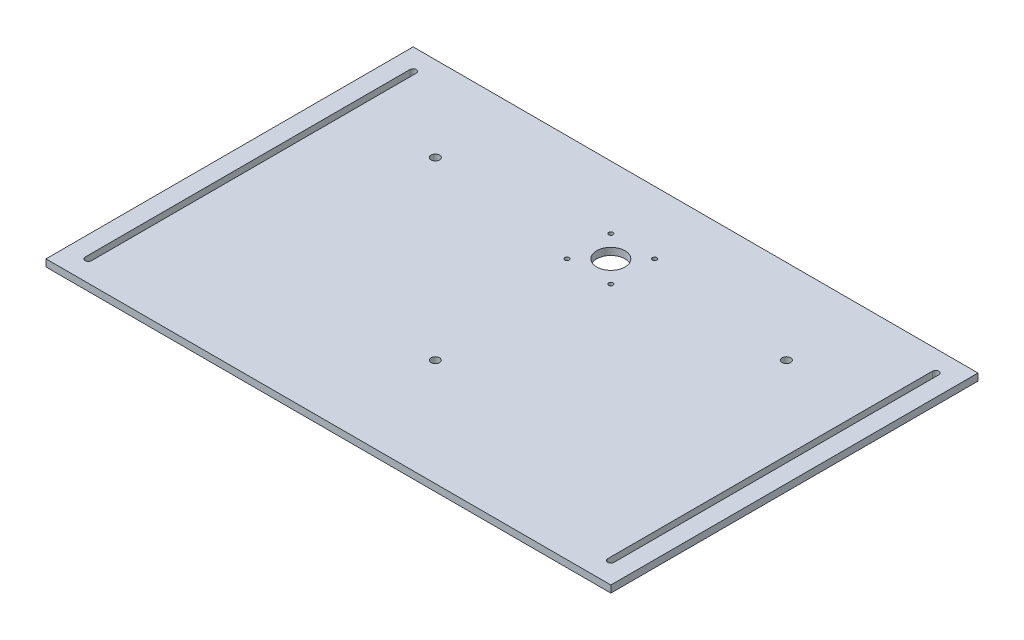
ISO-10303-21;
HEADER;
FILE_DESCRIPTION(('STEP AP214'),'2;1');
FILE_NAME('part.step','',(''),(''),'','','');
FILE_SCHEMA(('AUTOMOTIVE_DESIGN { 1 0 10303 214 1 1 1 1 }'));
ENDSEC;
DATA;
#1=APPLICATION_CONTEXT('core data for automotive mechanical design processes');
#2=APPLICATION_PROTOCOL_DEFINITION('international standard','automotive_design',2000,#1);
#3=PRODUCT_CONTEXT('',#1,'mechanical');
#4=PRODUCT('Part','Part','',(#3));
#5=PRODUCT_RELATED_PRODUCT_CATEGORY('part','',(#4));
#6=PRODUCT_DEFINITION_FORMATION('','',#4);
#7=PRODUCT_DEFINITION_CONTEXT('part definition',#1,'design');
#8=PRODUCT_DEFINITION('design','',#6,#7);
#9=PRODUCT_DEFINITION_SHAPE('','',#8);
#10=(LENGTH_UNIT() NAMED_UNIT(*) SI_UNIT(.MILLI.,.METRE.));
#11=(NAMED_UNIT(*) PLANE_ANGLE_UNIT() SI_UNIT($,.RADIAN.));
#12=(NAMED_UNIT(*) SI_UNIT($,.STERADIAN.) SOLID_ANGLE_UNIT());
#13=UNCERTAINTY_MEASURE_WITH_UNIT(LENGTH_MEASURE(1.E-05),#10,'distance_accuracy_value','');
#14=(GEOMETRIC_REPRESENTATION_CONTEXT(3) GLOBAL_UNCERTAINTY_ASSIGNED_CONTEXT((#13)) GLOBAL_UNIT_ASSIGNED_CONTEXT((#10,
#11,#12)) REPRESENTATION_CONTEXT('',''));
#15=CARTESIAN_POINT('',(0.,0.,0.));
#16=DIRECTION('',(0.,0.,1.));
#17=DIRECTION('',(1.,0.,0.));
#18=AXIS2_PLACEMENT_3D('',#15,#16,#17);
#19=CARTESIAN_POINT('',(-200.,5.,0.));
#20=DIRECTION('',(1.,0.,0.));
#21=DIRECTION('',(0.,0.,-1.));
#22=AXIS2_PLACEMENT_3D('',#19,#20,#21);
#23=PLANE('',#22);
#24=DIRECTION('',(0.,0.,1.));
#25=VECTOR('',#24,1.);
#26=CARTESIAN_POINT('',(-200.,0.,0.));
#27=LINE('',#26,#25);
#28=CARTESIAN_POINT('',(-200.,0.,-130.));
#29=VERTEX_POINT('',#28);
#30=CARTESIAN_POINT('',(-200.,0.,130.));
#31=VERTEX_POINT('',#30);
#32=EDGE_CURVE('E168',#29,#31,#27,.T.);
#33=ORIENTED_EDGE('',*,*,#32,.T.);
#34=DIRECTION('',(0.,-1.,0.));
#35=VECTOR('',#34,1.);
#36=CARTESIAN_POINT('',(-200.,5.,130.));
#37=LINE('',#36,#35);
#38=CARTESIAN_POINT('',(-200.,5.,130.));
#39=VERTEX_POINT('',#38);
#40=EDGE_CURVE('E11',#39,#31,#37,.T.);
#41=ORIENTED_EDGE('',*,*,#40,.F.);
#42=DIRECTION('',(0.,0.,1.));
#43=VECTOR('',#42,1.);
#44=CARTESIAN_POINT('',(-200.,5.,0.));
#45=LINE('',#44,#43);
#46=CARTESIAN_POINT('',(-200.,5.,-130.));
#47=VERTEX_POINT('',#46);
#48=EDGE_CURVE('E202',#47,#39,#45,.T.);
#49=ORIENTED_EDGE('',*,*,#48,.F.);
#50=DIRECTION('',(0.,-1.,0.));
#51=VECTOR('',#50,1.);
#52=CARTESIAN_POINT('',(-200.,5.,-130.));
#53=LINE('',#52,#51);
#54=EDGE_CURVE('E214',#47,#29,#53,.T.);
#55=ORIENTED_EDGE('',*,*,#54,.T.);
#56=EDGE_LOOP('',(#33,#41,#49,#55));
#57=FACE_BOUND('',#56,.T.);
#58=ADVANCED_FACE('F40',(#57),#23,.F.);
#59=CARTESIAN_POINT('',(0.,5.,130.));
#60=DIRECTION('',(0.,0.,-1.));
#61=DIRECTION('',(-1.,0.,0.));
#62=AXIS2_PLACEMENT_3D('',#59,#60,#61);
#63=PLANE('',#62);
#64=DIRECTION('',(1.,0.,0.));
#65=VECTOR('',#64,1.);
#66=CARTESIAN_POINT('',(0.,0.,130.));
#67=LINE('',#66,#65);
#68=CARTESIAN_POINT('',(200.,0.,130.));
#69=VERTEX_POINT('',#68);
#70=EDGE_CURVE('E217',#31,#69,#67,.T.);
#71=ORIENTED_EDGE('',*,*,#70,.T.);
#72=DIRECTION('',(0.,-1.,0.));
#73=VECTOR('',#72,1.);
#74=CARTESIAN_POINT('',(200.,5.,130.));
#75=LINE('',#74,#73);
#76=CARTESIAN_POINT('',(200.,5.,130.));
#77=VERTEX_POINT('',#76);
#78=EDGE_CURVE('E47',#77,#69,#75,.T.);
#79=ORIENTED_EDGE('',*,*,#78,.F.);
#80=DIRECTION('',(1.,0.,0.));
#81=VECTOR('',#80,1.);
#82=CARTESIAN_POINT('',(0.,5.,130.));
#83=LINE('',#82,#81);
#84=EDGE_CURVE('E205',#39,#77,#83,.T.);
#85=ORIENTED_EDGE('',*,*,#84,.F.);
#86=ORIENTED_EDGE('',*,*,#40,.T.);
#87=EDGE_LOOP('',(#71,#79,#85,#86));
#88=FACE_BOUND('',#87,.T.);
#89=ADVANCED_FACE('F233',(#88),#63,.F.);
#90=CARTESIAN_POINT('',(200.,5.,0.));
#91=DIRECTION('',(1.,0.,0.));
#92=DIRECTION('',(0.,0.,-1.));
#93=AXIS2_PLACEMENT_3D('',#90,#91,#92);
#94=PLANE('',#93);
#95=DIRECTION('',(0.,0.,1.));
#96=VECTOR('',#95,1.);
#97=CARTESIAN_POINT('',(200.,0.,0.));
#98=LINE('',#97,#96);
#99=CARTESIAN_POINT('',(200.,0.,-130.));
#100=VERTEX_POINT('',#99);
#101=EDGE_CURVE('E220',#100,#69,#98,.T.);
#102=ORIENTED_EDGE('',*,*,#101,.F.);
#103=DIRECTION('',(0.,-1.,0.));
#104=VECTOR('',#103,1.);
#105=CARTESIAN_POINT('',(200.,5.,-130.));
#106=LINE('',#105,#104);
#107=CARTESIAN_POINT('',(200.,5.,-130.));
#108=VERTEX_POINT('',#107);
#109=EDGE_CURVE('E226',#108,#100,#106,.T.);
#110=ORIENTED_EDGE('',*,*,#109,.F.);
#111=DIRECTION('',(0.,0.,1.));
#112=VECTOR('',#111,1.);
#113=CARTESIAN_POINT('',(200.,5.,0.));
#114=LINE('',#113,#112);
#115=EDGE_CURVE('E208',#108,#77,#114,.T.);
#116=ORIENTED_EDGE('',*,*,#115,.T.);
#117=ORIENTED_EDGE('',*,*,#78,.T.);
#118=EDGE_LOOP('',(#102,#110,#116,#117));
#119=FACE_BOUND('',#118,.T.);
#120=ADVANCED_FACE('F230',(#119),#94,.T.);
#121=CARTESIAN_POINT('',(0.,5.,-130.));
#122=DIRECTION('',(0.,0.,-1.));
#123=DIRECTION('',(-1.,0.,0.));
#124=AXIS2_PLACEMENT_3D('',#121,#122,#123);
#125=PLANE('',#124);
#126=DIRECTION('',(1.,0.,0.));
#127=VECTOR('',#126,1.);
#128=CARTESIAN_POINT('',(0.,0.,-130.));
#129=LINE('',#128,#127);
#130=EDGE_CURVE('E206',#29,#100,#129,.T.);
#131=ORIENTED_EDGE('',*,*,#130,.F.);
#132=ORIENTED_EDGE('',*,*,#54,.F.);
#133=DIRECTION('',(1.,0.,0.));
#134=VECTOR('',#133,1.);
#135=CARTESIAN_POINT('',(0.,5.,-130.));
#136=LINE('',#135,#134);
#137=EDGE_CURVE('E211',#47,#108,#136,.T.);
#138=ORIENTED_EDGE('',*,*,#137,.T.);
#139=ORIENTED_EDGE('',*,*,#109,.T.);
#140=EDGE_LOOP('',(#131,#132,#138,#139));
#141=FACE_BOUND('',#140,.T.);
#142=ADVANCED_FACE('F239',(#141),#125,.T.);
#143=CARTESIAN_POINT('',(0.,5.,0.));
#144=DIRECTION('',(0.,1.,0.));
#145=DIRECTION('',(0.,0.,1.));
#146=AXIS2_PLACEMENT_3D('',#143,#144,#145);
#147=PLANE('',#146);
#148=CARTESIAN_POINT('',(-15.5,5.,-85.5));
#149=DIRECTION('',(0.,1.,0.));
#150=DIRECTION('',(0.,0.,1.));
#151=AXIS2_PLACEMENT_3D('',#148,#149,#150);
#152=CIRCLE('',#151,1.54999999999998);
#153=CARTESIAN_POINT('',(-15.5,5.,-83.95));
#154=VERTEX_POINT('',#153);
#155=EDGE_CURVE('E349',#154,#154,#152,.T.);
#156=ORIENTED_EDGE('',*,*,#155,.F.);
#157=EDGE_LOOP('',(#156));
#158=FACE_BOUND('',#157,.T.);
#159=CARTESIAN_POINT('',(15.5,5.,-85.5));
#160=DIRECTION('',(0.,1.,0.));
#161=DIRECTION('',(0.,0.,1.));
#162=AXIS2_PLACEMENT_3D('',#159,#160,#161);
#163=CIRCLE('',#162,1.54999999999999);
#164=CARTESIAN_POINT('',(15.5,5.,-83.95));
#165=VERTEX_POINT('',#164);
#166=EDGE_CURVE('E355',#165,#165,#163,.T.);
#167=ORIENTED_EDGE('',*,*,#166,.F.);
#168=EDGE_LOOP('',(#167));
#169=FACE_BOUND('',#168,.T.);
#170=CARTESIAN_POINT('',(-15.5,5.,-54.5));
#171=DIRECTION('',(0.,1.,0.));
#172=DIRECTION('',(0.,0.,1.));
#173=AXIS2_PLACEMENT_3D('',#170,#171,#172);
#174=CIRCLE('',#173,1.54999999999999);
#175=CARTESIAN_POINT('',(-15.5,5.,-52.95));
#176=VERTEX_POINT('',#175);
#177=EDGE_CURVE('E361',#176,#176,#174,.T.);
#178=ORIENTED_EDGE('',*,*,#177,.F.);
#179=EDGE_LOOP('',(#178));
#180=FACE_BOUND('',#179,.T.);
#181=CARTESIAN_POINT('',(15.5,5.,-54.5));
#182=DIRECTION('',(0.,1.,0.));
#183=DIRECTION('',(0.,0.,1.));
#184=AXIS2_PLACEMENT_3D('',#181,#182,#183);
#185=CIRCLE('',#184,1.54999999999999);
#186=CARTESIAN_POINT('',(15.5,5.,-52.95));
#187=VERTEX_POINT('',#186);
#188=EDGE_CURVE('E332',#187,#187,#185,.T.);
#189=ORIENTED_EDGE('',*,*,#188,.F.);
#190=EDGE_LOOP('',(#189));
#191=FACE_BOUND('',#190,.T.);
#192=CARTESIAN_POINT('',(-124.304765271664,5.,-70.));
#193=DIRECTION('',(0.,1.,0.));
#194=DIRECTION('',(0.,0.,1.));
#195=AXIS2_PLACEMENT_3D('',#192,#193,#194);
#196=CIRCLE('',#195,3.00000000000001);
#197=CARTESIAN_POINT('',(-124.304765271664,5.,-66.9999999999999));
#198=VERTEX_POINT('',#197);
#199=EDGE_CURVE('E328',#198,#198,#196,.T.);
#200=ORIENTED_EDGE('',*,*,#199,.F.);
#201=EDGE_LOOP('',(#200));
#202=FACE_BOUND('',#201,.T.);
#203=CARTESIAN_POINT('',(124.304765271663,5.,-69.9999999999996));
#204=DIRECTION('',(0.,1.,0.));
#205=DIRECTION('',(0.,0.,-1.));
#206=AXIS2_PLACEMENT_3D('',#203,#204,#205);
#207=CIRCLE('',#206,3.00000000000001);
#208=CARTESIAN_POINT('',(124.304765271663,5.,-72.9999999999996));
#209=VERTEX_POINT('',#208);
#210=EDGE_CURVE('E335',#209,#209,#207,.T.);
#211=ORIENTED_EDGE('',*,*,#210,.F.);
#212=EDGE_LOOP('',(#211));
#213=FACE_BOUND('',#212,.T.);
#214=CARTESIAN_POINT('',(-3.3146475757007E-13,5.,54.3047652716635));
#215=DIRECTION('',(0.,1.,0.));
#216=DIRECTION('',(0.,0.,1.));
#217=AXIS2_PLACEMENT_3D('',#214,#215,#216);
#218=CIRCLE('',#217,3.);
#219=CARTESIAN_POINT('',(-3.3146475757007E-13,5.,57.3047652716635));
#220=VERTEX_POINT('',#219);
#221=EDGE_CURVE('E343',#220,#220,#218,.T.);
#222=ORIENTED_EDGE('',*,*,#221,.F.);
#223=EDGE_LOOP('',(#222));
#224=FACE_BOUND('',#223,.T.);
#225=CARTESIAN_POINT('',(0.,5.,-70.));
#226=DIRECTION('',(0.,1.,0.));
#227=DIRECTION('',(0.,0.,1.));
#228=AXIS2_PLACEMENT_3D('',#225,#226,#227);
#229=CIRCLE('',#228,10.);
#230=CARTESIAN_POINT('',(0.,5.,-60.));
#231=VERTEX_POINT('',#230);
#232=EDGE_CURVE('E155',#231,#231,#229,.T.);
#233=ORIENTED_EDGE('',*,*,#232,.F.);
#234=EDGE_LOOP('',(#233));
#235=FACE_BOUND('',#234,.T.);
#236=CARTESIAN_POINT('',(-185.,5.,-115.));
#237=DIRECTION('',(0.,1.,0.));
#238=DIRECTION('',(0.,0.,1.));
#239=AXIS2_PLACEMENT_3D('',#236,#237,#238);
#240=CIRCLE('',#239,2.25);
#241=CARTESIAN_POINT('',(-182.75,5.,-115.));
#242=VERTEX_POINT('',#241);
#243=CARTESIAN_POINT('',(-187.25,5.,-115.));
#244=VERTEX_POINT('',#243);
#245=EDGE_CURVE('E54',#242,#244,#240,.T.);
#246=ORIENTED_EDGE('',*,*,#245,.F.);
#247=DIRECTION('',(0.,0.,-1.));
#248=VECTOR('',#247,1.);
#249=CARTESIAN_POINT('',(-182.75,5.,-115.));
#250=LINE('',#249,#248);
#251=CARTESIAN_POINT('',(-182.75,5.,115.));
#252=VERTEX_POINT('',#251);
#253=EDGE_CURVE('E149',#252,#242,#250,.T.);
#254=ORIENTED_EDGE('',*,*,#253,.F.);
#255=CARTESIAN_POINT('',(-185.,5.,115.));
#256=DIRECTION('',(0.,1.,0.));
#257=DIRECTION('',(0.,0.,1.));
#258=AXIS2_PLACEMENT_3D('',#255,#256,#257);
#259=CIRCLE('',#258,2.25);
#260=CARTESIAN_POINT('',(-187.25,5.,115.));
#261=VERTEX_POINT('',#260);
#262=EDGE_CURVE('E152',#261,#252,#259,.T.);
#263=ORIENTED_EDGE('',*,*,#262,.F.);
#264=DIRECTION('',(0.,0.,1.));
#265=VECTOR('',#264,1.);
#266=CARTESIAN_POINT('',(-187.25,5.,-115.));
#267=LINE('',#266,#265);
#268=EDGE_CURVE('E161',#244,#261,#267,.T.);
#269=ORIENTED_EDGE('',*,*,#268,.F.);
#270=EDGE_LOOP('',(#246,#254,#263,#269));
#271=FACE_BOUND('',#270,.T.);
#272=CARTESIAN_POINT('',(185.,5.,-115.));
#273=DIRECTION('',(0.,1.,0.));
#274=DIRECTION('',(0.,0.,-1.));
#275=AXIS2_PLACEMENT_3D('',#272,#273,#274);
#276=CIRCLE('',#275,2.25);
#277=CARTESIAN_POINT('',(187.25,5.,-115.));
#278=VERTEX_POINT('',#277);
#279=CARTESIAN_POINT('',(182.75,5.,-115.));
#280=VERTEX_POINT('',#279);
#281=EDGE_CURVE('E62',#278,#280,#276,.T.);
#282=ORIENTED_EDGE('',*,*,#281,.F.);
#283=DIRECTION('',(0.,0.,-1.));
#284=VECTOR('',#283,1.);
#285=CARTESIAN_POINT('',(187.25,5.,-115.));
#286=LINE('',#285,#284);
#287=CARTESIAN_POINT('',(187.25,5.,115.));
#288=VERTEX_POINT('',#287);
#289=EDGE_CURVE('E176',#288,#278,#286,.T.);
#290=ORIENTED_EDGE('',*,*,#289,.F.);
#291=CARTESIAN_POINT('',(185.,5.,115.));
#292=DIRECTION('',(0.,1.,0.));
#293=DIRECTION('',(0.,0.,-1.));
#294=AXIS2_PLACEMENT_3D('',#291,#292,#293);
#295=CIRCLE('',#294,2.25);
#296=CARTESIAN_POINT('',(182.75,5.,115.));
#297=VERTEX_POINT('',#296);
#298=EDGE_CURVE('E191',#297,#288,#295,.T.);
#299=ORIENTED_EDGE('',*,*,#298,.F.);
#300=DIRECTION('',(0.,0.,1.));
#301=VECTOR('',#300,1.);
#302=CARTESIAN_POINT('',(182.75,5.,-115.));
#303=LINE('',#302,#301);
#304=EDGE_CURVE('E187',#280,#297,#303,.T.);
#305=ORIENTED_EDGE('',*,*,#304,.F.);
#306=EDGE_LOOP('',(#282,#290,#299,#305));
#307=FACE_BOUND('',#306,.T.);
#308=ORIENTED_EDGE('',*,*,#48,.T.);
#309=ORIENTED_EDGE('',*,*,#84,.T.);
#310=ORIENTED_EDGE('',*,*,#115,.F.);
#311=ORIENTED_EDGE('',*,*,#137,.F.);
#312=EDGE_LOOP('',(#308,#309,#310,#311));
#313=FACE_BOUND('',#312,.T.);
#314=ADVANCED_FACE('F243',(#158,#169,#180,#191,#202,#213,#224,#235,#271,#307,#313),#147,.T.);
#315=CARTESIAN_POINT('',(0.,0.,0.));
#316=DIRECTION('',(0.,1.,0.));
#317=DIRECTION('',(0.,0.,1.));
#318=AXIS2_PLACEMENT_3D('',#315,#316,#317);
#319=PLANE('',#318);
#320=CARTESIAN_POINT('',(-15.5,0.,-85.5));
#321=DIRECTION('',(0.,1.,0.));
#322=DIRECTION('',(0.,0.,1.));
#323=AXIS2_PLACEMENT_3D('',#320,#321,#322);
#324=CIRCLE('',#323,1.54999999999998);
#325=CARTESIAN_POINT('',(-15.5,0.,-83.95));
#326=VERTEX_POINT('',#325);
#327=EDGE_CURVE('E346',#326,#326,#324,.T.);
#328=ORIENTED_EDGE('',*,*,#327,.T.);
#329=EDGE_LOOP('',(#328));
#330=FACE_BOUND('',#329,.T.);
#331=CARTESIAN_POINT('',(15.5,0.,-85.5));
#332=DIRECTION('',(0.,1.,0.));
#333=DIRECTION('',(0.,0.,1.));
#334=AXIS2_PLACEMENT_3D('',#331,#332,#333);
#335=CIRCLE('',#334,1.54999999999999);
#336=CARTESIAN_POINT('',(15.5,0.,-83.95));
#337=VERTEX_POINT('',#336);
#338=EDGE_CURVE('E352',#337,#337,#335,.T.);
#339=ORIENTED_EDGE('',*,*,#338,.T.);
#340=EDGE_LOOP('',(#339));
#341=FACE_BOUND('',#340,.T.);
#342=CARTESIAN_POINT('',(-15.5,0.,-54.5));
#343=DIRECTION('',(0.,1.,0.));
#344=DIRECTION('',(0.,0.,1.));
#345=AXIS2_PLACEMENT_3D('',#342,#343,#344);
#346=CIRCLE('',#345,1.54999999999999);
#347=CARTESIAN_POINT('',(-15.5,0.,-52.95));
#348=VERTEX_POINT('',#347);
#349=EDGE_CURVE('E358',#348,#348,#346,.T.);
#350=ORIENTED_EDGE('',*,*,#349,.T.);
#351=EDGE_LOOP('',(#350));
#352=FACE_BOUND('',#351,.T.);
#353=CARTESIAN_POINT('',(15.5,0.,-54.5));
#354=DIRECTION('',(0.,1.,0.));
#355=DIRECTION('',(0.,0.,1.));
#356=AXIS2_PLACEMENT_3D('',#353,#354,#355);
#357=CIRCLE('',#356,1.54999999999999);
#358=CARTESIAN_POINT('',(15.5,0.,-52.95));
#359=VERTEX_POINT('',#358);
#360=EDGE_CURVE('E364',#359,#359,#357,.T.);
#361=ORIENTED_EDGE('',*,*,#360,.T.);
#362=EDGE_LOOP('',(#361));
#363=FACE_BOUND('',#362,.T.);
#364=CARTESIAN_POINT('',(-124.304765271664,0.,-70.));
#365=DIRECTION('',(0.,1.,0.));
#366=DIRECTION('',(0.,0.,1.));
#367=AXIS2_PLACEMENT_3D('',#364,#365,#366);
#368=CIRCLE('',#367,3.00000000000001);
#369=CARTESIAN_POINT('',(-124.304765271664,0.,-66.9999999999999));
#370=VERTEX_POINT('',#369);
#371=EDGE_CURVE('E325',#370,#370,#368,.T.);
#372=ORIENTED_EDGE('',*,*,#371,.T.);
#373=EDGE_LOOP('',(#372));
#374=FACE_BOUND('',#373,.T.);
#375=CARTESIAN_POINT('',(124.304765271663,0.,-69.9999999999996));
#376=DIRECTION('',(0.,1.,0.));
#377=DIRECTION('',(0.,0.,-1.));
#378=AXIS2_PLACEMENT_3D('',#375,#376,#377);
#379=CIRCLE('',#378,3.00000000000001);
#380=CARTESIAN_POINT('',(124.304765271663,0.,-72.9999999999996));
#381=VERTEX_POINT('',#380);
#382=EDGE_CURVE('E330',#381,#381,#379,.T.);
#383=ORIENTED_EDGE('',*,*,#382,.T.);
#384=EDGE_LOOP('',(#383));
#385=FACE_BOUND('',#384,.T.);
#386=CARTESIAN_POINT('',(-3.3146475757007E-13,0.,54.3047652716635));
#387=DIRECTION('',(0.,1.,0.));
#388=DIRECTION('',(0.,0.,1.));
#389=AXIS2_PLACEMENT_3D('',#386,#387,#388);
#390=CIRCLE('',#389,3.);
#391=CARTESIAN_POINT('',(-3.3146475757007E-13,0.,57.3047652716635));
#392=VERTEX_POINT('',#391);
#393=EDGE_CURVE('E340',#392,#392,#390,.T.);
#394=ORIENTED_EDGE('',*,*,#393,.T.);
#395=EDGE_LOOP('',(#394));
#396=FACE_BOUND('',#395,.T.);
#397=CARTESIAN_POINT('',(0.,0.,-70.));
#398=DIRECTION('',(0.,1.,0.));
#399=DIRECTION('',(0.,0.,1.));
#400=AXIS2_PLACEMENT_3D('',#397,#398,#399);
#401=CIRCLE('',#400,10.);
#402=CARTESIAN_POINT('',(0.,0.,-60.));
#403=VERTEX_POINT('',#402);
#404=EDGE_CURVE('E188',#403,#403,#401,.T.);
#405=ORIENTED_EDGE('',*,*,#404,.T.);
#406=EDGE_LOOP('',(#405));
#407=FACE_BOUND('',#406,.T.);
#408=DIRECTION('',(0.,0.,-1.));
#409=VECTOR('',#408,1.);
#410=CARTESIAN_POINT('',(-182.75,0.,-115.));
#411=LINE('',#410,#409);
#412=CARTESIAN_POINT('',(-182.75,0.,115.));
#413=VERTEX_POINT('',#412);
#414=CARTESIAN_POINT('',(-182.75,0.,-115.));
#415=VERTEX_POINT('',#414);
#416=EDGE_CURVE('E136',#413,#415,#411,.T.);
#417=ORIENTED_EDGE('',*,*,#416,.T.);
#418=CARTESIAN_POINT('',(-185.,0.,-115.));
#419=DIRECTION('',(0.,1.,0.));
#420=DIRECTION('',(0.,0.,1.));
#421=AXIS2_PLACEMENT_3D('',#418,#419,#420);
#422=CIRCLE('',#421,2.25);
#423=CARTESIAN_POINT('',(-187.25,0.,-115.));
#424=VERTEX_POINT('',#423);
#425=EDGE_CURVE('E130',#415,#424,#422,.T.);
#426=ORIENTED_EDGE('',*,*,#425,.T.);
#427=DIRECTION('',(0.,0.,1.));
#428=VECTOR('',#427,1.);
#429=CARTESIAN_POINT('',(-187.25,0.,-115.));
#430=LINE('',#429,#428);
#431=CARTESIAN_POINT('',(-187.25,0.,115.));
#432=VERTEX_POINT('',#431);
#433=EDGE_CURVE('E140',#424,#432,#430,.T.);
#434=ORIENTED_EDGE('',*,*,#433,.T.);
#435=CARTESIAN_POINT('',(-185.,0.,115.));
#436=DIRECTION('',(0.,1.,0.));
#437=DIRECTION('',(0.,0.,1.));
#438=AXIS2_PLACEMENT_3D('',#435,#436,#437);
#439=CIRCLE('',#438,2.25);
#440=EDGE_CURVE('E144',#432,#413,#439,.T.);
#441=ORIENTED_EDGE('',*,*,#440,.T.);
#442=EDGE_LOOP('',(#417,#426,#434,#441));
#443=FACE_BOUND('',#442,.T.);
#444=DIRECTION('',(0.,0.,-1.));
#445=VECTOR('',#444,1.);
#446=CARTESIAN_POINT('',(187.25,0.,-115.));
#447=LINE('',#446,#445);
#448=CARTESIAN_POINT('',(187.25,0.,115.));
#449=VERTEX_POINT('',#448);
#450=CARTESIAN_POINT('',(187.25,0.,-115.));
#451=VERTEX_POINT('',#450);
#452=EDGE_CURVE('E182',#449,#451,#447,.T.);
#453=ORIENTED_EDGE('',*,*,#452,.T.);
#454=CARTESIAN_POINT('',(185.,0.,-115.));
#455=DIRECTION('',(0.,1.,0.));
#456=DIRECTION('',(0.,0.,-1.));
#457=AXIS2_PLACEMENT_3D('',#454,#455,#456);
#458=CIRCLE('',#457,2.25);
#459=CARTESIAN_POINT('',(182.75,0.,-115.));
#460=VERTEX_POINT('',#459);
#461=EDGE_CURVE('E172',#451,#460,#458,.T.);
#462=ORIENTED_EDGE('',*,*,#461,.T.);
#463=DIRECTION('',(0.,0.,1.));
#464=VECTOR('',#463,1.);
#465=CARTESIAN_POINT('',(182.75,0.,-115.));
#466=LINE('',#465,#464);
#467=CARTESIAN_POINT('',(182.75,0.,115.));
#468=VERTEX_POINT('',#467);
#469=EDGE_CURVE('E175',#460,#468,#466,.T.);
#470=ORIENTED_EDGE('',*,*,#469,.T.);
#471=CARTESIAN_POINT('',(185.,0.,115.));
#472=DIRECTION('',(0.,1.,0.));
#473=DIRECTION('',(0.,0.,-1.));
#474=AXIS2_PLACEMENT_3D('',#471,#472,#473);
#475=CIRCLE('',#474,2.25);
#476=EDGE_CURVE('E179',#468,#449,#475,.T.);
#477=ORIENTED_EDGE('',*,*,#476,.T.);
#478=EDGE_LOOP('',(#453,#462,#470,#477));
#479=FACE_BOUND('',#478,.T.);
#480=ORIENTED_EDGE('',*,*,#32,.F.);
#481=ORIENTED_EDGE('',*,*,#130,.T.);
#482=ORIENTED_EDGE('',*,*,#101,.T.);
#483=ORIENTED_EDGE('',*,*,#70,.F.);
#484=EDGE_LOOP('',(#480,#481,#482,#483));
#485=FACE_BOUND('',#484,.T.);
#486=ADVANCED_FACE('F146',(#330,#341,#352,#363,#374,#385,#396,#407,#443,#479,#485),#319,.F.);
#487=CARTESIAN_POINT('',(185.,0.,-115.));
#488=DIRECTION('',(0.,1.,0.));
#489=DIRECTION('',(0.,0.,1.));
#490=AXIS2_PLACEMENT_3D('',#487,#488,#489);
#491=CYLINDRICAL_SURFACE('',#490,2.25);
#492=ORIENTED_EDGE('',*,*,#281,.T.);
#493=DIRECTION('',(0.,1.,0.));
#494=VECTOR('',#493,1.);
#495=CARTESIAN_POINT('',(182.75,0.,-115.));
#496=LINE('',#495,#494);
#497=EDGE_CURVE('E185',#460,#280,#496,.T.);
#498=ORIENTED_EDGE('',*,*,#497,.F.);
#499=ORIENTED_EDGE('',*,*,#461,.F.);
#500=DIRECTION('',(0.,1.,0.));
#501=VECTOR('',#500,1.);
#502=CARTESIAN_POINT('',(187.25,0.,-115.));
#503=LINE('',#502,#501);
#504=EDGE_CURVE('E162',#451,#278,#503,.T.);
#505=ORIENTED_EDGE('',*,*,#504,.T.);
#506=EDGE_LOOP('',(#492,#498,#499,#505));
#507=FACE_BOUND('',#506,.T.);
#508=ADVANCED_FACE('F258',(#507),#491,.F.);
#509=CARTESIAN_POINT('',(187.25,0.,-115.));
#510=DIRECTION('',(1.,0.,0.));
#511=DIRECTION('',(0.,0.,-1.));
#512=AXIS2_PLACEMENT_3D('',#509,#510,#511);
#513=PLANE('',#512);
#514=ORIENTED_EDGE('',*,*,#289,.T.);
#515=ORIENTED_EDGE('',*,*,#504,.F.);
#516=ORIENTED_EDGE('',*,*,#452,.F.);
#517=DIRECTION('',(0.,1.,0.));
#518=VECTOR('',#517,1.);
#519=CARTESIAN_POINT('',(187.25,0.,115.));
#520=LINE('',#519,#518);
#521=EDGE_CURVE('E197',#449,#288,#520,.T.);
#522=ORIENTED_EDGE('',*,*,#521,.T.);
#523=EDGE_LOOP('',(#514,#515,#516,#522));
#524=FACE_BOUND('',#523,.T.);
#525=ADVANCED_FACE('F265',(#524),#513,.F.);
#526=CARTESIAN_POINT('',(185.,0.,115.));
#527=DIRECTION('',(0.,1.,0.));
#528=DIRECTION('',(0.,0.,1.));
#529=AXIS2_PLACEMENT_3D('',#526,#527,#528);
#530=CYLINDRICAL_SURFACE('',#529,2.25);
#531=ORIENTED_EDGE('',*,*,#298,.T.);
#532=ORIENTED_EDGE('',*,*,#521,.F.);
#533=ORIENTED_EDGE('',*,*,#476,.F.);
#534=DIRECTION('',(0.,1.,0.));
#535=VECTOR('',#534,1.);
#536=CARTESIAN_POINT('',(182.75,0.,115.));
#537=LINE('',#536,#535);
#538=EDGE_CURVE('E199',#468,#297,#537,.T.);
#539=ORIENTED_EDGE('',*,*,#538,.T.);
#540=EDGE_LOOP('',(#531,#532,#533,#539));
#541=FACE_BOUND('',#540,.T.);
#542=ADVANCED_FACE('F269',(#541),#530,.F.);
#543=CARTESIAN_POINT('',(182.75,0.,-115.));
#544=DIRECTION('',(-1.,0.,0.));
#545=DIRECTION('',(0.,0.,1.));
#546=AXIS2_PLACEMENT_3D('',#543,#544,#545);
#547=PLANE('',#546);
#548=ORIENTED_EDGE('',*,*,#304,.T.);
#549=ORIENTED_EDGE('',*,*,#538,.F.);
#550=ORIENTED_EDGE('',*,*,#469,.F.);
#551=ORIENTED_EDGE('',*,*,#497,.T.);
#552=EDGE_LOOP('',(#548,#549,#550,#551));
#553=FACE_BOUND('',#552,.T.);
#554=ADVANCED_FACE('F266',(#553),#547,.F.);
#555=CARTESIAN_POINT('',(-185.,0.,-115.));
#556=DIRECTION('',(0.,1.,0.));
#557=DIRECTION('',(0.,0.,1.));
#558=AXIS2_PLACEMENT_3D('',#555,#556,#557);
#559=CYLINDRICAL_SURFACE('',#558,2.25);
#560=ORIENTED_EDGE('',*,*,#245,.T.);
#561=DIRECTION('',(0.,1.,0.));
#562=VECTOR('',#561,1.);
#563=CARTESIAN_POINT('',(-187.25,0.,-115.));
#564=LINE('',#563,#562);
#565=EDGE_CURVE('E126',#424,#244,#564,.T.);
#566=ORIENTED_EDGE('',*,*,#565,.F.);
#567=ORIENTED_EDGE('',*,*,#425,.F.);
#568=DIRECTION('',(0.,1.,0.));
#569=VECTOR('',#568,1.);
#570=CARTESIAN_POINT('',(-182.75,0.,-115.));
#571=LINE('',#570,#569);
#572=EDGE_CURVE('E166',#415,#242,#571,.T.);
#573=ORIENTED_EDGE('',*,*,#572,.T.);
#574=EDGE_LOOP('',(#560,#566,#567,#573));
#575=FACE_BOUND('',#574,.T.);
#576=ADVANCED_FACE('F128',(#575),#559,.F.);
#577=CARTESIAN_POINT('',(-182.75,0.,-115.));
#578=DIRECTION('',(1.,0.,0.));
#579=DIRECTION('',(0.,0.,-1.));
#580=AXIS2_PLACEMENT_3D('',#577,#578,#579);
#581=PLANE('',#580);
#582=ORIENTED_EDGE('',*,*,#253,.T.);
#583=ORIENTED_EDGE('',*,*,#572,.F.);
#584=ORIENTED_EDGE('',*,*,#416,.F.);
#585=DIRECTION('',(0.,1.,0.));
#586=VECTOR('',#585,1.);
#587=CARTESIAN_POINT('',(-182.75,0.,115.));
#588=LINE('',#587,#586);
#589=EDGE_CURVE('E169',#413,#252,#588,.T.);
#590=ORIENTED_EDGE('',*,*,#589,.T.);
#591=EDGE_LOOP('',(#582,#583,#584,#590));
#592=FACE_BOUND('',#591,.T.);
#593=ADVANCED_FACE('F279',(#592),#581,.F.);
#594=CARTESIAN_POINT('',(-185.,0.,115.));
#595=DIRECTION('',(0.,1.,0.));
#596=DIRECTION('',(0.,0.,1.));
#597=AXIS2_PLACEMENT_3D('',#594,#595,#596);
#598=CYLINDRICAL_SURFACE('',#597,2.25);
#599=ORIENTED_EDGE('',*,*,#262,.T.);
#600=ORIENTED_EDGE('',*,*,#589,.F.);
#601=ORIENTED_EDGE('',*,*,#440,.F.);
#602=DIRECTION('',(0.,1.,0.));
#603=VECTOR('',#602,1.);
#604=CARTESIAN_POINT('',(-187.25,0.,115.));
#605=LINE('',#604,#603);
#606=EDGE_CURVE('E135',#432,#261,#605,.T.);
#607=ORIENTED_EDGE('',*,*,#606,.T.);
#608=EDGE_LOOP('',(#599,#600,#601,#607));
#609=FACE_BOUND('',#608,.T.);
#610=ADVANCED_FACE('F283',(#609),#598,.F.);
#611=CARTESIAN_POINT('',(-187.25,0.,-115.));
#612=DIRECTION('',(-1.,0.,0.));
#613=DIRECTION('',(0.,0.,1.));
#614=AXIS2_PLACEMENT_3D('',#611,#612,#613);
#615=PLANE('',#614);
#616=ORIENTED_EDGE('',*,*,#268,.T.);
#617=ORIENTED_EDGE('',*,*,#606,.F.);
#618=ORIENTED_EDGE('',*,*,#433,.F.);
#619=ORIENTED_EDGE('',*,*,#565,.T.);
#620=EDGE_LOOP('',(#616,#617,#618,#619));
#621=FACE_BOUND('',#620,.T.);
#622=ADVANCED_FACE('F141',(#621),#615,.F.);
#623=CARTESIAN_POINT('',(0.,0.,-70.));
#624=DIRECTION('',(0.,1.,0.));
#625=DIRECTION('',(0.,0.,1.));
#626=AXIS2_PLACEMENT_3D('',#623,#624,#625);
#627=CYLINDRICAL_SURFACE('',#626,10.);
#628=ORIENTED_EDGE('',*,*,#404,.F.);
#629=EDGE_LOOP('',(#628));
#630=FACE_BOUND('',#629,.T.);
#631=ORIENTED_EDGE('',*,*,#232,.T.);
#632=EDGE_LOOP('',(#631));
#633=FACE_BOUND('',#632,.T.);
#634=ADVANCED_FACE('F282',(#630,#633),#627,.F.);
#635=CARTESIAN_POINT('',(-3.3146475757007E-13,0.,54.3047652716635));
#636=DIRECTION('',(0.,1.,0.));
#637=DIRECTION('',(0.,0.,1.));
#638=AXIS2_PLACEMENT_3D('',#635,#636,#637);
#639=CYLINDRICAL_SURFACE('',#638,3.);
#640=ORIENTED_EDGE('',*,*,#393,.F.);
#641=EDGE_LOOP('',(#640));
#642=FACE_BOUND('',#641,.T.);
#643=ORIENTED_EDGE('',*,*,#221,.T.);
#644=EDGE_LOOP('',(#643));
#645=FACE_BOUND('',#644,.T.);
#646=ADVANCED_FACE('F292',(#642,#645),#639,.F.);
#647=CARTESIAN_POINT('',(124.304765271663,0.,-69.9999999999996));
#648=DIRECTION('',(0.,1.,0.));
#649=DIRECTION('',(0.,0.,1.));
#650=AXIS2_PLACEMENT_3D('',#647,#648,#649);
#651=CYLINDRICAL_SURFACE('',#650,3.00000000000001);
#652=ORIENTED_EDGE('',*,*,#382,.F.);
#653=EDGE_LOOP('',(#652));
#654=FACE_BOUND('',#653,.T.);
#655=ORIENTED_EDGE('',*,*,#210,.T.);
#656=EDGE_LOOP('',(#655));
#657=FACE_BOUND('',#656,.T.);
#658=ADVANCED_FACE('F313',(#654,#657),#651,.F.);
#659=CARTESIAN_POINT('',(-124.304765271664,0.,-70.));
#660=DIRECTION('',(0.,1.,0.));
#661=DIRECTION('',(0.,0.,1.));
#662=AXIS2_PLACEMENT_3D('',#659,#660,#661);
#663=CYLINDRICAL_SURFACE('',#662,3.00000000000001);
#664=ORIENTED_EDGE('',*,*,#371,.F.);
#665=EDGE_LOOP('',(#664));
#666=FACE_BOUND('',#665,.T.);
#667=ORIENTED_EDGE('',*,*,#199,.T.);
#668=EDGE_LOOP('',(#667));
#669=FACE_BOUND('',#668,.T.);
#670=ADVANCED_FACE('F298',(#666,#669),#663,.F.);
#671=CARTESIAN_POINT('',(15.5,0.,-54.5));
#672=DIRECTION('',(0.,1.,0.));
#673=DIRECTION('',(0.,0.,1.));
#674=AXIS2_PLACEMENT_3D('',#671,#672,#673);
#675=CYLINDRICAL_SURFACE('',#674,1.54999999999999);
#676=ORIENTED_EDGE('',*,*,#360,.F.);
#677=EDGE_LOOP('',(#676));
#678=FACE_BOUND('',#677,.T.);
#679=ORIENTED_EDGE('',*,*,#188,.T.);
#680=EDGE_LOOP('',(#679));
#681=FACE_BOUND('',#680,.T.);
#682=ADVANCED_FACE('F294',(#678,#681),#675,.F.);
#683=CARTESIAN_POINT('',(-15.5,0.,-54.5));
#684=DIRECTION('',(0.,1.,0.));
#685=DIRECTION('',(0.,0.,1.));
#686=AXIS2_PLACEMENT_3D('',#683,#684,#685);
#687=CYLINDRICAL_SURFACE('',#686,1.54999999999999);
#688=ORIENTED_EDGE('',*,*,#349,.F.);
#689=EDGE_LOOP('',(#688));
#690=FACE_BOUND('',#689,.T.);
#691=ORIENTED_EDGE('',*,*,#177,.T.);
#692=EDGE_LOOP('',(#691));
#693=FACE_BOUND('',#692,.T.);
#694=ADVANCED_FACE('F297',(#690,#693),#687,.F.);
#695=CARTESIAN_POINT('',(15.5,0.,-85.5));
#696=DIRECTION('',(0.,1.,0.));
#697=DIRECTION('',(0.,0.,1.));
#698=AXIS2_PLACEMENT_3D('',#695,#696,#697);
#699=CYLINDRICAL_SURFACE('',#698,1.54999999999999);
#700=ORIENTED_EDGE('',*,*,#338,.F.);
#701=EDGE_LOOP('',(#700));
#702=FACE_BOUND('',#701,.T.);
#703=ORIENTED_EDGE('',*,*,#166,.T.);
#704=EDGE_LOOP('',(#703));
#705=FACE_BOUND('',#704,.T.);
#706=ADVANCED_FACE('F302',(#702,#705),#699,.F.);
#707=CARTESIAN_POINT('',(-15.5,0.,-85.5));
#708=DIRECTION('',(0.,1.,0.));
#709=DIRECTION('',(0.,0.,1.));
#710=AXIS2_PLACEMENT_3D('',#707,#708,#709);
#711=CYLINDRICAL_SURFACE('',#710,1.54999999999998);
#712=ORIENTED_EDGE('',*,*,#327,.F.);
#713=EDGE_LOOP('',(#712));
#714=FACE_BOUND('',#713,.T.);
#715=ORIENTED_EDGE('',*,*,#155,.T.);
#716=EDGE_LOOP('',(#715));
#717=FACE_BOUND('',#716,.T.);
#718=ADVANCED_FACE('F306',(#714,#717),#711,.F.);
#719=CLOSED_SHELL('',(#58,#89,#120,#142,#314,#486,#508,#525,#542,#554,#576,#593,#610,#622,#634,
#646,#658,#670,#682,#694,#706,#718));
#720=MANIFOLD_SOLID_BREP('B2',#719);
#721=ADVANCED_BREP_SHAPE_REPRESENTATION('',(#18,#720),#14);
#722=SHAPE_DEFINITION_REPRESENTATION(#9,#721);
ENDSEC;
END-ISO-10303-21;
